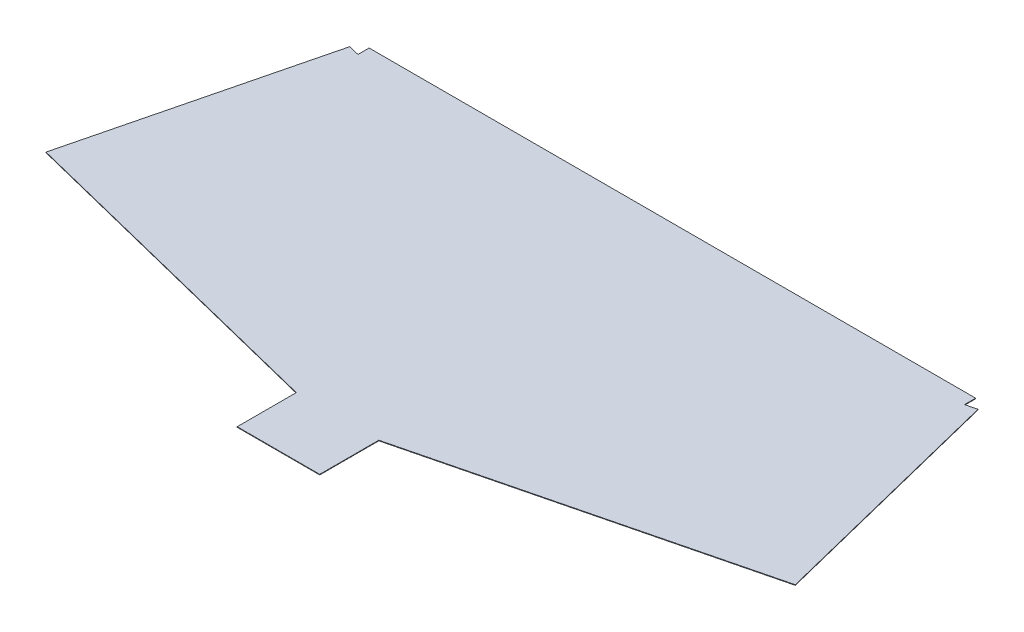
ISO-10303-21;
HEADER;
FILE_DESCRIPTION(('STEP AP214'),'2;1');
FILE_NAME('part.step','',(''),(''),'','','');
FILE_SCHEMA(('AUTOMOTIVE_DESIGN { 1 0 10303 214 1 1 1 1 }'));
ENDSEC;
DATA;
#1=APPLICATION_CONTEXT('core data for automotive mechanical design processes');
#2=APPLICATION_PROTOCOL_DEFINITION('international standard','automotive_design',2000,#1);
#3=PRODUCT_CONTEXT('',#1,'mechanical');
#4=PRODUCT('Part','Part','',(#3));
#5=PRODUCT_RELATED_PRODUCT_CATEGORY('part','',(#4));
#6=PRODUCT_DEFINITION_FORMATION('','',#4);
#7=PRODUCT_DEFINITION_CONTEXT('part definition',#1,'design');
#8=PRODUCT_DEFINITION('design','',#6,#7);
#9=PRODUCT_DEFINITION_SHAPE('','',#8);
#10=(LENGTH_UNIT() NAMED_UNIT(*) SI_UNIT(.MILLI.,.METRE.));
#11=(NAMED_UNIT(*) PLANE_ANGLE_UNIT() SI_UNIT($,.RADIAN.));
#12=(NAMED_UNIT(*) SI_UNIT($,.STERADIAN.) SOLID_ANGLE_UNIT());
#13=UNCERTAINTY_MEASURE_WITH_UNIT(LENGTH_MEASURE(1.E-05),#10,'distance_accuracy_value','');
#14=(GEOMETRIC_REPRESENTATION_CONTEXT(3) GLOBAL_UNCERTAINTY_ASSIGNED_CONTEXT((#13)) GLOBAL_UNIT_ASSIGNED_CONTEXT((#10,
#11,#12)) REPRESENTATION_CONTEXT('',''));
#15=CARTESIAN_POINT('',(0.,0.,0.));
#16=DIRECTION('',(0.,0.,1.));
#17=DIRECTION('',(1.,0.,0.));
#18=AXIS2_PLACEMENT_3D('',#15,#16,#17);
#19=CARTESIAN_POINT('',(-284.309741609456,1.,0.));
#20=DIRECTION('',(1.,0.,0.));
#21=DIRECTION('',(0.,0.,-1.));
#22=AXIS2_PLACEMENT_3D('',#19,#20,#21);
#23=PLANE('',#22);
#24=DIRECTION('',(0.,0.,1.));
#25=VECTOR('',#24,1.);
#26=CARTESIAN_POINT('',(-284.309741609456,0.,0.));
#27=LINE('',#26,#25);
#28=CARTESIAN_POINT('',(-284.309741609456,0.,519.733094859993));
#29=VERTEX_POINT('',#28);
#30=CARTESIAN_POINT('',(-284.309741609456,0.,625.733094859993));
#31=VERTEX_POINT('',#30);
#32=EDGE_CURVE('E163',#29,#31,#27,.T.);
#33=ORIENTED_EDGE('',*,*,#32,.F.);
#34=DIRECTION('',(0.,-1.,0.));
#35=VECTOR('',#34,1.);
#36=CARTESIAN_POINT('',(-284.309741609456,1.,519.733094859993));
#37=LINE('',#36,#35);
#38=CARTESIAN_POINT('',(-284.309741609456,1.,519.733094859993));
#39=VERTEX_POINT('',#38);
#40=EDGE_CURVE('E11',#39,#29,#37,.T.);
#41=ORIENTED_EDGE('',*,*,#40,.F.);
#42=DIRECTION('',(0.,0.,1.));
#43=VECTOR('',#42,1.);
#44=CARTESIAN_POINT('',(-284.309741609456,1.,0.));
#45=LINE('',#44,#43);
#46=CARTESIAN_POINT('',(-284.309741609456,1.,625.733094859993));
#47=VERTEX_POINT('',#46);
#48=EDGE_CURVE('E197',#39,#47,#45,.T.);
#49=ORIENTED_EDGE('',*,*,#48,.T.);
#50=DIRECTION('',(0.,-1.,0.));
#51=VECTOR('',#50,1.);
#52=CARTESIAN_POINT('',(-284.309741609456,1.,625.733094859993));
#53=LINE('',#52,#51);
#54=EDGE_CURVE('E101',#47,#31,#53,.T.);
#55=ORIENTED_EDGE('',*,*,#54,.T.);
#56=EDGE_LOOP('',(#33,#41,#49,#55));
#57=FACE_BOUND('',#56,.T.);
#58=ADVANCED_FACE('F33',(#57),#23,.T.);
#59=CARTESIAN_POINT('',(105.342411563577,1.,422.604757408474));
#60=DIRECTION('',(-0.241868311144223,0.,-0.970309084809702));
#61=DIRECTION('',(-0.970309084809702,0.,0.241868311144223));
#62=AXIS2_PLACEMENT_3D('',#59,#60,#61);
#63=PLANE('',#62);
#64=DIRECTION('',(0.970309084809702,0.,-0.241868311144223));
#65=VECTOR('',#64,1.);
#66=CARTESIAN_POINT('',(105.342411563577,0.,422.604757408474));
#67=LINE('',#66,#65);
#68=CARTESIAN_POINT('',(294.379685643796,0.,375.483559698512));
#69=VERTEX_POINT('',#68);
#70=EDGE_CURVE('E166',#29,#69,#67,.T.);
#71=ORIENTED_EDGE('',*,*,#70,.T.);
#72=DIRECTION('',(0.,-1.,0.));
#73=VECTOR('',#72,1.);
#74=CARTESIAN_POINT('',(294.379685643796,1.,375.483559698512));
#75=LINE('',#74,#73);
#76=CARTESIAN_POINT('',(294.379685643796,1.,375.483559698512));
#77=VERTEX_POINT('',#76);
#78=EDGE_CURVE('E41',#77,#69,#75,.T.);
#79=ORIENTED_EDGE('',*,*,#78,.F.);
#80=DIRECTION('',(0.970309084809702,0.,-0.241868311144223));
#81=VECTOR('',#80,1.);
#82=CARTESIAN_POINT('',(105.342411563577,1.,422.604757408474));
#83=LINE('',#82,#81);
#84=EDGE_CURVE('E244',#39,#77,#83,.T.);
#85=ORIENTED_EDGE('',*,*,#84,.F.);
#86=ORIENTED_EDGE('',*,*,#40,.T.);
#87=EDGE_LOOP('',(#71,#79,#85,#86));
#88=FACE_BOUND('',#87,.T.);
#89=ADVANCED_FACE('F271',(#88),#63,.F.);
#90=CARTESIAN_POINT('',(105.249479480594,1.,422.588179978576));
#91=DIRECTION('',(-0.241676330590973,0.,-0.970356919505438));
#92=DIRECTION('',(-0.970356919505438,0.,0.241676330590973));
#93=AXIS2_PLACEMENT_3D('',#90,#91,#92);
#94=PLANE('',#93);
#95=DIRECTION('',(0.970356919505438,0.,-0.241676330590973));
#96=VECTOR('',#95,1.);
#97=CARTESIAN_POINT('',(105.249479480594,0.,422.588179978576));
#98=LINE('',#97,#96);
#99=CARTESIAN_POINT('',(313.786824033904,0.,370.650033086692));
#100=VERTEX_POINT('',#99);
#101=EDGE_CURVE('E168',#69,#100,#98,.T.);
#102=ORIENTED_EDGE('',*,*,#101,.T.);
#103=DIRECTION('',(0.,-1.,0.));
#104=VECTOR('',#103,1.);
#105=CARTESIAN_POINT('',(313.786824033904,1.,370.650033086692));
#106=LINE('',#105,#104);
#107=CARTESIAN_POINT('',(313.786824033904,1.,370.650033086692));
#108=VERTEX_POINT('',#107);
#109=EDGE_CURVE('E216',#108,#100,#106,.T.);
#110=ORIENTED_EDGE('',*,*,#109,.F.);
#111=DIRECTION('',(0.970356919505438,0.,-0.241676330590973));
#112=VECTOR('',#111,1.);
#113=CARTESIAN_POINT('',(105.249479480594,1.,422.588179978576));
#114=LINE('',#113,#112);
#115=EDGE_CURVE('E225',#77,#108,#114,.T.);
#116=ORIENTED_EDGE('',*,*,#115,.F.);
#117=ORIENTED_EDGE('',*,*,#78,.T.);
#118=EDGE_LOOP('',(#102,#110,#116,#117));
#119=FACE_BOUND('',#118,.T.);
#120=ADVANCED_FACE('F223',(#119),#94,.F.);
#121=CARTESIAN_POINT('',(208.53734455331,1.,-51.9381468918841));
#122=DIRECTION('',(-0.970356919505438,0.,0.241676330590974));
#123=DIRECTION('',(0.241676330590974,0.,0.970356919505438));
#124=AXIS2_PLACEMENT_3D('',#121,#122,#123);
#125=PLANE('',#124);
#126=DIRECTION('',(-0.241676330590974,0.,-0.970356919505438));
#127=VECTOR('',#126,1.);
#128=CARTESIAN_POINT('',(208.53734455331,0.,-51.9381468918841));
#129=LINE('',#128,#127);
#130=CARTESIAN_POINT('',(205.097396780653,0.,-65.7499137114679));
#131=VERTEX_POINT('',#130);
#132=EDGE_CURVE('E170',#100,#131,#129,.T.);
#133=ORIENTED_EDGE('',*,*,#132,.T.);
#134=DIRECTION('',(0.,-1.,0.));
#135=VECTOR('',#134,1.);
#136=CARTESIAN_POINT('',(205.097396780653,1.,-65.7499137114679));
#137=LINE('',#136,#135);
#138=CARTESIAN_POINT('',(205.097396780653,1.,-65.7499137114679));
#139=VERTEX_POINT('',#138);
#140=EDGE_CURVE('E214',#139,#131,#137,.T.);
#141=ORIENTED_EDGE('',*,*,#140,.F.);
#142=DIRECTION('',(-0.241676330590974,0.,-0.970356919505438));
#143=VECTOR('',#142,1.);
#144=CARTESIAN_POINT('',(208.53734455331,1.,-51.9381468918841));
#145=LINE('',#144,#143);
#146=EDGE_CURVE('E238',#108,#139,#145,.T.);
#147=ORIENTED_EDGE('',*,*,#146,.F.);
#148=ORIENTED_EDGE('',*,*,#109,.T.);
#149=EDGE_LOOP('',(#133,#141,#147,#148));
#150=FACE_BOUND('',#149,.T.);
#151=ADVANCED_FACE('F235',(#150),#125,.F.);
#152=CARTESIAN_POINT('',(-3.43994777265715,1.,-13.8117668195838));
#153=DIRECTION('',(-0.241676330590974,0.,-0.970356919505438));
#154=DIRECTION('',(-0.970356919505438,0.,0.241676330590974));
#155=AXIS2_PLACEMENT_3D('',#152,#153,#154);
#156=PLANE('',#155);
#157=DIRECTION('',(0.970356919505438,0.,-0.241676330590974));
#158=VECTOR('',#157,1.);
#159=CARTESIAN_POINT('',(-3.43994777265715,0.,-13.8117668195838));
#160=LINE('',#159,#158);
#161=CARTESIAN_POINT('',(185.690258390544,0.,-60.9163870996484));
#162=VERTEX_POINT('',#161);
#163=EDGE_CURVE('E173',#162,#131,#160,.T.);
#164=ORIENTED_EDGE('',*,*,#163,.F.);
#165=DIRECTION('',(0.,-1.,0.));
#166=VECTOR('',#165,1.);
#167=CARTESIAN_POINT('',(185.690258390544,1.,-60.9163870996484));
#168=LINE('',#167,#166);
#169=CARTESIAN_POINT('',(185.690258390544,1.,-60.9163870996484));
#170=VERTEX_POINT('',#169);
#171=EDGE_CURVE('E212',#170,#162,#168,.T.);
#172=ORIENTED_EDGE('',*,*,#171,.F.);
#173=DIRECTION('',(0.970356919505438,0.,-0.241676330590974));
#174=VECTOR('',#173,1.);
#175=CARTESIAN_POINT('',(-3.43994777265715,1.,-13.8117668195838));
#176=LINE('',#175,#174);
#177=EDGE_CURVE('E240',#170,#139,#176,.T.);
#178=ORIENTED_EDGE('',*,*,#177,.T.);
#179=ORIENTED_EDGE('',*,*,#140,.T.);
#180=EDGE_LOOP('',(#164,#172,#178,#179));
#181=FACE_BOUND('',#180,.T.);
#182=ADVANCED_FACE('F281',(#181),#156,.T.);
#183=CARTESIAN_POINT('',(185.690258390544,1.,0.));
#184=DIRECTION('',(-1.,0.,0.));
#185=DIRECTION('',(0.,0.,1.));
#186=AXIS2_PLACEMENT_3D('',#183,#184,#185);
#187=PLANE('',#186);
#188=DIRECTION('',(0.,0.,-1.));
#189=VECTOR('',#188,1.);
#190=CARTESIAN_POINT('',(185.690258390544,0.,0.));
#191=LINE('',#190,#189);
#192=CARTESIAN_POINT('',(185.690258390544,0.,-80.9163870996484));
#193=VERTEX_POINT('',#192);
#194=EDGE_CURVE('E176',#162,#193,#191,.T.);
#195=ORIENTED_EDGE('',*,*,#194,.T.);
#196=DIRECTION('',(0.,-1.,0.));
#197=VECTOR('',#196,1.);
#198=CARTESIAN_POINT('',(185.690258390544,1.,-80.9163870996484));
#199=LINE('',#198,#197);
#200=CARTESIAN_POINT('',(185.690258390544,1.,-80.9163870996484));
#201=VERTEX_POINT('',#200);
#202=EDGE_CURVE('E210',#201,#193,#199,.T.);
#203=ORIENTED_EDGE('',*,*,#202,.F.);
#204=DIRECTION('',(0.,0.,-1.));
#205=VECTOR('',#204,1.);
#206=CARTESIAN_POINT('',(185.690258390544,1.,0.));
#207=LINE('',#206,#205);
#208=EDGE_CURVE('E242',#170,#201,#207,.T.);
#209=ORIENTED_EDGE('',*,*,#208,.F.);
#210=ORIENTED_EDGE('',*,*,#171,.T.);
#211=EDGE_LOOP('',(#195,#203,#209,#210));
#212=FACE_BOUND('',#211,.T.);
#213=ADVANCED_FACE('F284',(#212),#187,.F.);
#214=CARTESIAN_POINT('',(0.,1.,-80.9163870996484));
#215=DIRECTION('',(0.,0.,-1.));
#216=DIRECTION('',(-1.,0.,0.));
#217=AXIS2_PLACEMENT_3D('',#214,#215,#216);
#218=PLANE('',#217);
#219=DIRECTION('',(1.,0.,0.));
#220=VECTOR('',#219,1.);
#221=CARTESIAN_POINT('',(0.,0.,-80.9163870996484));
#222=LINE('',#221,#220);
#223=CARTESIAN_POINT('',(-902.309741609456,0.,-80.9163870996484));
#224=VERTEX_POINT('',#223);
#225=EDGE_CURVE('E179',#224,#193,#222,.T.);
#226=ORIENTED_EDGE('',*,*,#225,.F.);
#227=DIRECTION('',(0.,-1.,0.));
#228=VECTOR('',#227,1.);
#229=CARTESIAN_POINT('',(-902.309741609456,1.,-80.9163870996484));
#230=LINE('',#229,#228);
#231=CARTESIAN_POINT('',(-902.309741609456,1.,-80.9163870996484));
#232=VERTEX_POINT('',#231);
#233=EDGE_CURVE('E208',#232,#224,#230,.T.);
#234=ORIENTED_EDGE('',*,*,#233,.F.);
#235=DIRECTION('',(1.,0.,0.));
#236=VECTOR('',#235,1.);
#237=CARTESIAN_POINT('',(0.,1.,-80.9163870996484));
#238=LINE('',#237,#236);
#239=EDGE_CURVE('E249',#232,#201,#238,.T.);
#240=ORIENTED_EDGE('',*,*,#239,.T.);
#241=ORIENTED_EDGE('',*,*,#202,.T.);
#242=EDGE_LOOP('',(#226,#234,#240,#241));
#243=FACE_BOUND('',#242,.T.);
#244=ADVANCED_FACE('F288',(#243),#218,.T.);
#245=CARTESIAN_POINT('',(-902.309741609456,1.,0.));
#246=DIRECTION('',(-1.,0.,0.));
#247=DIRECTION('',(0.,0.,1.));
#248=AXIS2_PLACEMENT_3D('',#245,#246,#247);
#249=PLANE('',#248);
#250=DIRECTION('',(0.,0.,-1.));
#251=VECTOR('',#250,1.);
#252=CARTESIAN_POINT('',(-902.309741609456,0.,0.));
#253=LINE('',#252,#251);
#254=CARTESIAN_POINT('',(-902.309741609456,0.,-60.9163870996484));
#255=VERTEX_POINT('',#254);
#256=EDGE_CURVE('E182',#255,#224,#253,.T.);
#257=ORIENTED_EDGE('',*,*,#256,.F.);
#258=DIRECTION('',(0.,-1.,0.));
#259=VECTOR('',#258,1.);
#260=CARTESIAN_POINT('',(-902.309741609456,1.,-60.9163870996484));
#261=LINE('',#260,#259);
#262=CARTESIAN_POINT('',(-902.309741609456,1.,-60.9163870996484));
#263=VERTEX_POINT('',#262);
#264=EDGE_CURVE('E206',#263,#255,#261,.T.);
#265=ORIENTED_EDGE('',*,*,#264,.F.);
#266=DIRECTION('',(0.,0.,-1.));
#267=VECTOR('',#266,1.);
#268=CARTESIAN_POINT('',(-902.309741609456,1.,0.));
#269=LINE('',#268,#267);
#270=EDGE_CURVE('E252',#263,#232,#269,.T.);
#271=ORIENTED_EDGE('',*,*,#270,.T.);
#272=ORIENTED_EDGE('',*,*,#233,.T.);
#273=EDGE_LOOP('',(#257,#265,#271,#272));
#274=FACE_BOUND('',#273,.T.);
#275=ADVANCED_FACE('F292',(#274),#249,.T.);
#276=CARTESIAN_POINT('',(-38.4159679795435,1.,154.24431617815));
#277=DIRECTION('',(-0.241676330590975,0.,0.970356919505437));
#278=DIRECTION('',(0.970356919505437,0.,0.241676330590975));
#279=AXIS2_PLACEMENT_3D('',#276,#277,#278);
#280=PLANE('',#279);
#281=DIRECTION('',(-0.970356919505437,0.,-0.241676330590975));
#282=VECTOR('',#281,1.);
#283=CARTESIAN_POINT('',(-38.4159679795435,0.,154.24431617815));
#284=LINE('',#283,#282);
#285=CARTESIAN_POINT('',(-921.716879999565,0.,-65.7499137114679));
#286=VERTEX_POINT('',#285);
#287=EDGE_CURVE('E185',#255,#286,#284,.T.);
#288=ORIENTED_EDGE('',*,*,#287,.T.);
#289=DIRECTION('',(0.,-1.,0.));
#290=VECTOR('',#289,1.);
#291=CARTESIAN_POINT('',(-921.716879999565,1.,-65.7499137114679));
#292=LINE('',#291,#290);
#293=CARTESIAN_POINT('',(-921.716879999565,1.,-65.7499137114679));
#294=VERTEX_POINT('',#293);
#295=EDGE_CURVE('E203',#294,#286,#292,.T.);
#296=ORIENTED_EDGE('',*,*,#295,.F.);
#297=DIRECTION('',(-0.970356919505437,0.,-0.241676330590975));
#298=VECTOR('',#297,1.);
#299=CARTESIAN_POINT('',(-38.4159679795435,1.,154.24431617815));
#300=LINE('',#299,#298);
#301=EDGE_CURVE('E255',#263,#294,#300,.T.);
#302=ORIENTED_EDGE('',*,*,#301,.F.);
#303=ORIENTED_EDGE('',*,*,#264,.T.);
#304=EDGE_LOOP('',(#288,#296,#302,#303));
#305=FACE_BOUND('',#304,.T.);
#306=ADVANCED_FACE('F296',(#305),#280,.F.);
#307=CARTESIAN_POINT('',(-883.300912020021,1.,-219.994229889618));
#308=DIRECTION('',(0.970356919505437,0.,0.241676330590975));
#309=DIRECTION('',(0.241676330590975,0.,-0.970356919505437));
#310=AXIS2_PLACEMENT_3D('',#307,#308,#309);
#311=PLANE('',#310);
#312=DIRECTION('',(-0.241676330590975,0.,0.970356919505437));
#313=VECTOR('',#312,1.);
#314=CARTESIAN_POINT('',(-883.300912020021,0.,-219.994229889618));
#315=LINE('',#314,#313);
#316=CARTESIAN_POINT('',(-1030.40630725282,0.,370.650033086692));
#317=VERTEX_POINT('',#316);
#318=EDGE_CURVE('E187',#286,#317,#315,.T.);
#319=ORIENTED_EDGE('',*,*,#318,.T.);
#320=DIRECTION('',(0.,-1.,0.));
#321=VECTOR('',#320,1.);
#322=CARTESIAN_POINT('',(-1030.40630725282,1.,370.650033086692));
#323=LINE('',#322,#321);
#324=CARTESIAN_POINT('',(-1030.40630725282,1.,370.650033086692));
#325=VERTEX_POINT('',#324);
#326=EDGE_CURVE('E201',#325,#317,#323,.T.);
#327=ORIENTED_EDGE('',*,*,#326,.F.);
#328=DIRECTION('',(-0.241676330590975,0.,0.970356919505437));
#329=VECTOR('',#328,1.);
#330=CARTESIAN_POINT('',(-883.300912020021,1.,-219.994229889618));
#331=LINE('',#330,#329);
#332=EDGE_CURVE('E158',#294,#325,#331,.T.);
#333=ORIENTED_EDGE('',*,*,#332,.F.);
#334=ORIENTED_EDGE('',*,*,#295,.T.);
#335=EDGE_LOOP('',(#319,#327,#333,#334));
#336=FACE_BOUND('',#335,.T.);
#337=ADVANCED_FACE('F262',(#336),#311,.F.);
#338=CARTESIAN_POINT('',(-147.105395232797,1.,590.644262976311));
#339=DIRECTION('',(-0.241676330590977,0.,0.970356919505437));
#340=DIRECTION('',(0.970356919505437,0.,0.241676330590977));
#341=AXIS2_PLACEMENT_3D('',#338,#339,#340);
#342=PLANE('',#341);
#343=DIRECTION('',(-0.970356919505437,0.,-0.241676330590977));
#344=VECTOR('',#343,1.);
#345=CARTESIAN_POINT('',(-147.105395232797,0.,590.644262976311));
#346=LINE('',#345,#344);
#347=CARTESIAN_POINT('',(-1010.99916886271,0.,375.483559698512));
#348=VERTEX_POINT('',#347);
#349=EDGE_CURVE('E190',#348,#317,#346,.T.);
#350=ORIENTED_EDGE('',*,*,#349,.F.);
#351=DIRECTION('',(0.,-1.,0.));
#352=VECTOR('',#351,1.);
#353=CARTESIAN_POINT('',(-1010.99916886271,1.,375.483559698512));
#354=LINE('',#353,#352);
#355=CARTESIAN_POINT('',(-1010.99916886271,1.,375.483559698512));
#356=VERTEX_POINT('',#355);
#357=EDGE_CURVE('E147',#356,#348,#354,.T.);
#358=ORIENTED_EDGE('',*,*,#357,.F.);
#359=DIRECTION('',(-0.970356919505437,0.,-0.241676330590977));
#360=VECTOR('',#359,1.);
#361=CARTESIAN_POINT('',(-147.105395232797,1.,590.644262976311));
#362=LINE('',#361,#360);
#363=EDGE_CURVE('E156',#356,#325,#362,.T.);
#364=ORIENTED_EDGE('',*,*,#363,.T.);
#365=ORIENTED_EDGE('',*,*,#326,.T.);
#366=EDGE_LOOP('',(#350,#358,#364,#365));
#367=FACE_BOUND('',#366,.T.);
#368=ADVANCED_FACE('F266',(#367),#342,.T.);
#369=CARTESIAN_POINT('',(-147.264851939302,1.,590.786048134498));
#370=DIRECTION('',(-0.241868311144223,0.,0.970309084809702));
#371=DIRECTION('',(0.970309084809702,0.,0.241868311144223));
#372=AXIS2_PLACEMENT_3D('',#369,#370,#371);
#373=PLANE('',#372);
#374=DIRECTION('',(-0.970309084809702,0.,-0.241868311144223));
#375=VECTOR('',#374,1.);
#376=CARTESIAN_POINT('',(-147.264851939302,0.,590.786048134498));
#377=LINE('',#376,#375);
#378=CARTESIAN_POINT('',(-432.309741609456,0.,519.733094859993));
#379=VERTEX_POINT('',#378);
#380=EDGE_CURVE('E146',#379,#348,#377,.T.);
#381=ORIENTED_EDGE('',*,*,#380,.F.);
#382=DIRECTION('',(0.,-1.,0.));
#383=VECTOR('',#382,1.);
#384=CARTESIAN_POINT('',(-432.309741609456,1.,519.733094859993));
#385=LINE('',#384,#383);
#386=CARTESIAN_POINT('',(-432.309741609456,1.,519.733094859993));
#387=VERTEX_POINT('',#386);
#388=EDGE_CURVE('E140',#387,#379,#385,.T.);
#389=ORIENTED_EDGE('',*,*,#388,.F.);
#390=DIRECTION('',(-0.970309084809702,0.,-0.241868311144223));
#391=VECTOR('',#390,1.);
#392=CARTESIAN_POINT('',(-147.264851939302,1.,590.786048134498));
#393=LINE('',#392,#391);
#394=EDGE_CURVE('E144',#387,#356,#393,.T.);
#395=ORIENTED_EDGE('',*,*,#394,.T.);
#396=ORIENTED_EDGE('',*,*,#357,.T.);
#397=EDGE_LOOP('',(#381,#389,#395,#396));
#398=FACE_BOUND('',#397,.T.);
#399=ADVANCED_FACE('F142',(#398),#373,.T.);
#400=CARTESIAN_POINT('',(-432.309741609456,1.,0.));
#401=DIRECTION('',(1.,0.,0.));
#402=DIRECTION('',(0.,0.,-1.));
#403=AXIS2_PLACEMENT_3D('',#400,#401,#402);
#404=PLANE('',#403);
#405=DIRECTION('',(0.,0.,1.));
#406=VECTOR('',#405,1.);
#407=CARTESIAN_POINT('',(-432.309741609456,0.,0.));
#408=LINE('',#407,#406);
#409=CARTESIAN_POINT('',(-432.309741609456,0.,625.733094859993));
#410=VERTEX_POINT('',#409);
#411=EDGE_CURVE('E94',#379,#410,#408,.T.);
#412=ORIENTED_EDGE('',*,*,#411,.T.);
#413=DIRECTION('',(0.,-1.,0.));
#414=VECTOR('',#413,1.);
#415=CARTESIAN_POINT('',(-432.309741609456,1.,625.733094859993));
#416=LINE('',#415,#414);
#417=CARTESIAN_POINT('',(-432.309741609456,1.,625.733094859993));
#418=VERTEX_POINT('',#417);
#419=EDGE_CURVE('E148',#418,#410,#416,.T.);
#420=ORIENTED_EDGE('',*,*,#419,.F.);
#421=DIRECTION('',(0.,0.,1.));
#422=VECTOR('',#421,1.);
#423=CARTESIAN_POINT('',(-432.309741609456,1.,0.));
#424=LINE('',#423,#422);
#425=EDGE_CURVE('E150',#387,#418,#424,.T.);
#426=ORIENTED_EDGE('',*,*,#425,.F.);
#427=ORIENTED_EDGE('',*,*,#388,.T.);
#428=EDGE_LOOP('',(#412,#420,#426,#427));
#429=FACE_BOUND('',#428,.T.);
#430=ADVANCED_FACE('F151',(#429),#404,.F.);
#431=CARTESIAN_POINT('',(0.,1.,625.733094859993));
#432=DIRECTION('',(0.,0.,-1.));
#433=DIRECTION('',(-1.,0.,0.));
#434=AXIS2_PLACEMENT_3D('',#431,#432,#433);
#435=PLANE('',#434);
#436=DIRECTION('',(1.,0.,0.));
#437=VECTOR('',#436,1.);
#438=CARTESIAN_POINT('',(0.,0.,625.733094859993));
#439=LINE('',#438,#437);
#440=EDGE_CURVE('E195',#410,#31,#439,.T.);
#441=ORIENTED_EDGE('',*,*,#440,.T.);
#442=ORIENTED_EDGE('',*,*,#54,.F.);
#443=DIRECTION('',(1.,0.,0.));
#444=VECTOR('',#443,1.);
#445=CARTESIAN_POINT('',(0.,1.,625.733094859993));
#446=LINE('',#445,#444);
#447=EDGE_CURVE('E49',#418,#47,#446,.T.);
#448=ORIENTED_EDGE('',*,*,#447,.F.);
#449=ORIENTED_EDGE('',*,*,#419,.T.);
#450=EDGE_LOOP('',(#441,#442,#448,#449));
#451=FACE_BOUND('',#450,.T.);
#452=ADVANCED_FACE('F269',(#451),#435,.F.);
#453=CARTESIAN_POINT('',(0.,1.,0.));
#454=DIRECTION('',(0.,1.,0.));
#455=DIRECTION('',(0.,0.,1.));
#456=AXIS2_PLACEMENT_3D('',#453,#454,#455);
#457=PLANE('',#456);
#458=ORIENTED_EDGE('',*,*,#48,.F.);
#459=ORIENTED_EDGE('',*,*,#84,.T.);
#460=ORIENTED_EDGE('',*,*,#115,.T.);
#461=ORIENTED_EDGE('',*,*,#146,.T.);
#462=ORIENTED_EDGE('',*,*,#177,.F.);
#463=ORIENTED_EDGE('',*,*,#208,.T.);
#464=ORIENTED_EDGE('',*,*,#239,.F.);
#465=ORIENTED_EDGE('',*,*,#270,.F.);
#466=ORIENTED_EDGE('',*,*,#301,.T.);
#467=ORIENTED_EDGE('',*,*,#332,.T.);
#468=ORIENTED_EDGE('',*,*,#363,.F.);
#469=ORIENTED_EDGE('',*,*,#394,.F.);
#470=ORIENTED_EDGE('',*,*,#425,.T.);
#471=ORIENTED_EDGE('',*,*,#447,.T.);
#472=EDGE_LOOP('',(#458,#459,#460,#461,#462,#463,#464,#465,#466,#467,#468,#469,#470,#471));
#473=FACE_BOUND('',#472,.T.);
#474=ADVANCED_FACE('F154',(#473),#457,.T.);
#475=CARTESIAN_POINT('',(0.,0.,0.));
#476=DIRECTION('',(0.,1.,0.));
#477=DIRECTION('',(0.,0.,1.));
#478=AXIS2_PLACEMENT_3D('',#475,#476,#477);
#479=PLANE('',#478);
#480=ORIENTED_EDGE('',*,*,#32,.T.);
#481=ORIENTED_EDGE('',*,*,#440,.F.);
#482=ORIENTED_EDGE('',*,*,#411,.F.);
#483=ORIENTED_EDGE('',*,*,#380,.T.);
#484=ORIENTED_EDGE('',*,*,#349,.T.);
#485=ORIENTED_EDGE('',*,*,#318,.F.);
#486=ORIENTED_EDGE('',*,*,#287,.F.);
#487=ORIENTED_EDGE('',*,*,#256,.T.);
#488=ORIENTED_EDGE('',*,*,#225,.T.);
#489=ORIENTED_EDGE('',*,*,#194,.F.);
#490=ORIENTED_EDGE('',*,*,#163,.T.);
#491=ORIENTED_EDGE('',*,*,#132,.F.);
#492=ORIENTED_EDGE('',*,*,#101,.F.);
#493=ORIENTED_EDGE('',*,*,#70,.F.);
#494=EDGE_LOOP('',(#480,#481,#482,#483,#484,#485,#486,#487,#488,#489,#490,#491,#492,#493));
#495=FACE_BOUND('',#494,.T.);
#496=ADVANCED_FACE('F230',(#495),#479,.F.);
#497=CLOSED_SHELL('',(#58,#89,#120,#151,#182,#213,#244,#275,#306,#337,#368,#399,#430,#452,#474,#496));
#498=MANIFOLD_SOLID_BREP('B2',#497);
#499=ADVANCED_BREP_SHAPE_REPRESENTATION('',(#18,#498),#14);
#500=SHAPE_DEFINITION_REPRESENTATION(#9,#499);
ENDSEC;
END-ISO-10303-21;
